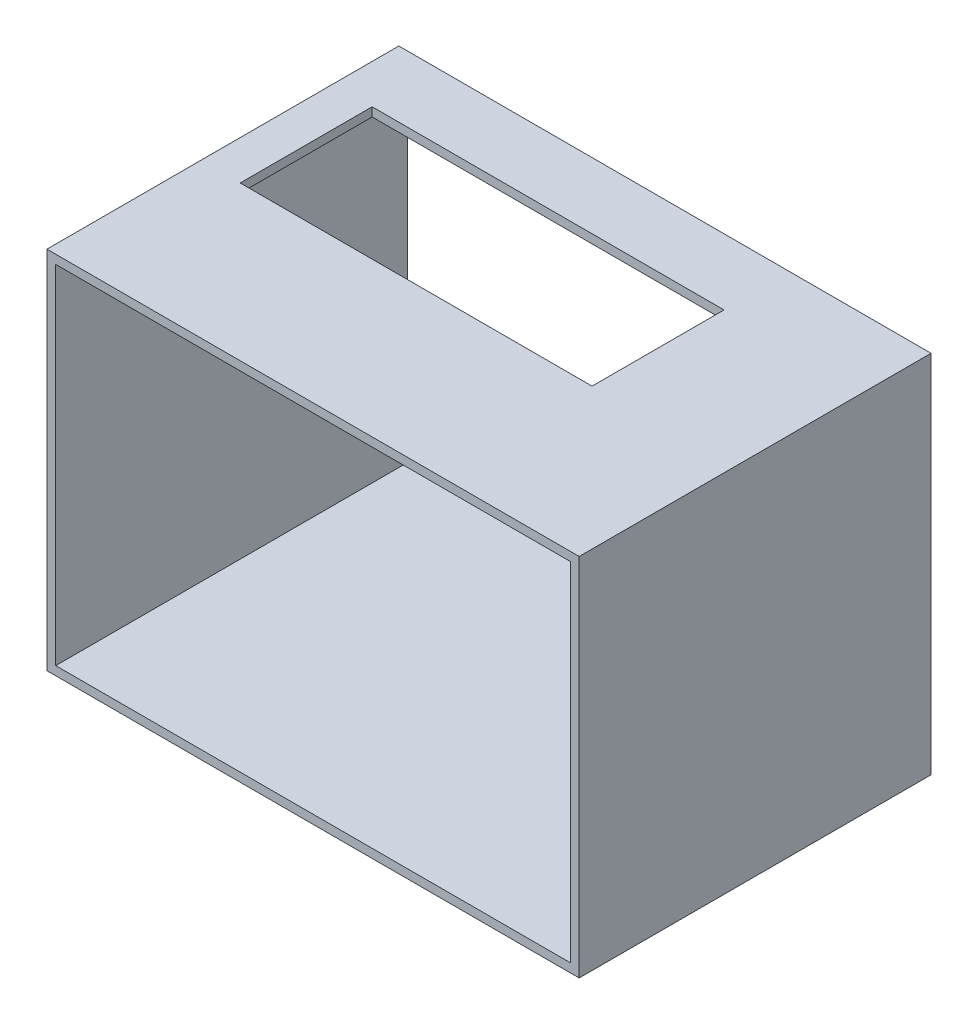
ISO-10303-21;
HEADER;
FILE_DESCRIPTION(('STEP AP214'),'2;1');
FILE_NAME('part.step','',(''),(''),'','','');
FILE_SCHEMA(('AUTOMOTIVE_DESIGN { 1 0 10303 214 1 1 1 1 }'));
ENDSEC;
DATA;
#1=APPLICATION_CONTEXT('core data for automotive mechanical design processes');
#2=APPLICATION_PROTOCOL_DEFINITION('international standard','automotive_design',2000,#1);
#3=PRODUCT_CONTEXT('',#1,'mechanical');
#4=PRODUCT('Part','Part','',(#3));
#5=PRODUCT_RELATED_PRODUCT_CATEGORY('part','',(#4));
#6=PRODUCT_DEFINITION_FORMATION('','',#4);
#7=PRODUCT_DEFINITION_CONTEXT('part definition',#1,'design');
#8=PRODUCT_DEFINITION('design','',#6,#7);
#9=PRODUCT_DEFINITION_SHAPE('','',#8);
#10=(LENGTH_UNIT() NAMED_UNIT(*) SI_UNIT(.MILLI.,.METRE.));
#11=(NAMED_UNIT(*) PLANE_ANGLE_UNIT() SI_UNIT($,.RADIAN.));
#12=(NAMED_UNIT(*) SI_UNIT($,.STERADIAN.) SOLID_ANGLE_UNIT());
#13=UNCERTAINTY_MEASURE_WITH_UNIT(LENGTH_MEASURE(1.E-05),#10,'distance_accuracy_value','');
#14=(GEOMETRIC_REPRESENTATION_CONTEXT(3) GLOBAL_UNCERTAINTY_ASSIGNED_CONTEXT((#13)) GLOBAL_UNIT_ASSIGNED_CONTEXT((#10,
#11,#12)) REPRESENTATION_CONTEXT('',''));
#15=CARTESIAN_POINT('',(0.,0.,0.));
#16=DIRECTION('',(0.,0.,1.));
#17=DIRECTION('',(1.,0.,0.));
#18=AXIS2_PLACEMENT_3D('',#15,#16,#17);
#19=CARTESIAN_POINT('',(0.,0.,80.));
#20=DIRECTION('',(0.,0.,1.));
#21=DIRECTION('',(1.,0.,0.));
#22=AXIS2_PLACEMENT_3D('',#19,#20,#21);
#23=PLANE('',#22);
#24=DIRECTION('',(0.,-1.,0.));
#25=VECTOR('',#24,1.);
#26=CARTESIAN_POINT('',(-40.1361731843575,31.6864525139665,80.));
#27=LINE('',#26,#25);
#28=CARTESIAN_POINT('',(-40.1361731843575,31.6864525139665,80.));
#29=VERTEX_POINT('',#28);
#30=CARTESIAN_POINT('',(-40.1361731843575,-51.3135474860335,80.));
#31=VERTEX_POINT('',#30);
#32=EDGE_CURVE('E211',#29,#31,#27,.T.);
#33=ORIENTED_EDGE('',*,*,#32,.T.);
#34=DIRECTION('',(1.,0.,0.));
#35=VECTOR('',#34,1.);
#36=CARTESIAN_POINT('',(-40.1361731843575,-51.3135474860335,80.));
#37=LINE('',#36,#35);
#38=CARTESIAN_POINT('',(80.8638268156425,-51.3135474860335,80.));
#39=VERTEX_POINT('',#38);
#40=EDGE_CURVE('E215',#31,#39,#37,.T.);
#41=ORIENTED_EDGE('',*,*,#40,.T.);
#42=DIRECTION('',(0.,1.,0.));
#43=VECTOR('',#42,1.);
#44=CARTESIAN_POINT('',(80.8638268156425,31.6864525139665,80.));
#45=LINE('',#44,#43);
#46=CARTESIAN_POINT('',(80.8638268156425,31.6864525139665,80.));
#47=VERTEX_POINT('',#46);
#48=EDGE_CURVE('E219',#39,#47,#45,.T.);
#49=ORIENTED_EDGE('',*,*,#48,.T.);
#50=DIRECTION('',(-1.,0.,0.));
#51=VECTOR('',#50,1.);
#52=CARTESIAN_POINT('',(-40.1361731843575,31.6864525139665,80.));
#53=LINE('',#52,#51);
#54=EDGE_CURVE('E222',#47,#29,#53,.T.);
#55=ORIENTED_EDGE('',*,*,#54,.T.);
#56=EDGE_LOOP('',(#33,#41,#49,#55));
#57=FACE_BOUND('',#56,.T.);
#58=DIRECTION('',(1.,0.,0.));
#59=VECTOR('',#58,1.);
#60=CARTESIAN_POINT('',(-38.1361731843575,-49.3135474860335,80.));
#61=LINE('',#60,#59);
#62=CARTESIAN_POINT('',(-38.1361731843575,-49.3135474860335,80.));
#63=VERTEX_POINT('',#62);
#64=CARTESIAN_POINT('',(78.8638268156425,-49.3135474860335,80.));
#65=VERTEX_POINT('',#64);
#66=EDGE_CURVE('E171',#63,#65,#61,.T.);
#67=ORIENTED_EDGE('',*,*,#66,.F.);
#68=DIRECTION('',(0.,-1.,0.));
#69=VECTOR('',#68,1.);
#70=CARTESIAN_POINT('',(-38.1361731843575,29.6864525139665,80.));
#71=LINE('',#70,#69);
#72=CARTESIAN_POINT('',(-38.1361731843575,29.6864525139665,80.));
#73=VERTEX_POINT('',#72);
#74=EDGE_CURVE('E168',#73,#63,#71,.T.);
#75=ORIENTED_EDGE('',*,*,#74,.F.);
#76=DIRECTION('',(-1.,0.,0.));
#77=VECTOR('',#76,1.);
#78=CARTESIAN_POINT('',(-38.1361731843575,29.6864525139665,80.));
#79=LINE('',#78,#77);
#80=CARTESIAN_POINT('',(78.8638268156425,29.6864525139665,80.));
#81=VERTEX_POINT('',#80);
#82=EDGE_CURVE('E179',#81,#73,#79,.T.);
#83=ORIENTED_EDGE('',*,*,#82,.F.);
#84=DIRECTION('',(0.,1.,0.));
#85=VECTOR('',#84,1.);
#86=CARTESIAN_POINT('',(78.8638268156425,29.6864525139665,80.));
#87=LINE('',#86,#85);
#88=EDGE_CURVE('E175',#65,#81,#87,.T.);
#89=ORIENTED_EDGE('',*,*,#88,.F.);
#90=EDGE_LOOP('',(#67,#75,#83,#89));
#91=FACE_BOUND('',#90,.T.);
#92=ADVANCED_FACE('F43',(#57,#91),#23,.T.);
#93=CARTESIAN_POINT('',(0.,0.,0.));
#94=DIRECTION('',(0.,0.,1.));
#95=DIRECTION('',(1.,0.,0.));
#96=AXIS2_PLACEMENT_3D('',#93,#94,#95);
#97=PLANE('',#96);
#98=DIRECTION('',(0.,-1.,0.));
#99=VECTOR('',#98,1.);
#100=CARTESIAN_POINT('',(-40.1361731843575,31.6864525139665,0.));
#101=LINE('',#100,#99);
#102=CARTESIAN_POINT('',(-40.1361731843575,31.6864525139665,0.));
#103=VERTEX_POINT('',#102);
#104=CARTESIAN_POINT('',(-40.1361731843575,-51.3135474860335,0.));
#105=VERTEX_POINT('',#104);
#106=EDGE_CURVE('E210',#103,#105,#101,.T.);
#107=ORIENTED_EDGE('',*,*,#106,.F.);
#108=DIRECTION('',(-1.,0.,0.));
#109=VECTOR('',#108,1.);
#110=CARTESIAN_POINT('',(-40.1361731843575,31.6864525139665,0.));
#111=LINE('',#110,#109);
#112=CARTESIAN_POINT('',(80.8638268156425,31.6864525139665,0.));
#113=VERTEX_POINT('',#112);
#114=EDGE_CURVE('E216',#113,#103,#111,.T.);
#115=ORIENTED_EDGE('',*,*,#114,.F.);
#116=DIRECTION('',(0.,1.,0.));
#117=VECTOR('',#116,1.);
#118=CARTESIAN_POINT('',(80.8638268156425,31.6864525139665,0.));
#119=LINE('',#118,#117);
#120=CARTESIAN_POINT('',(80.8638268156425,-51.3135474860335,0.));
#121=VERTEX_POINT('',#120);
#122=EDGE_CURVE('E232',#121,#113,#119,.T.);
#123=ORIENTED_EDGE('',*,*,#122,.F.);
#124=DIRECTION('',(1.,0.,0.));
#125=VECTOR('',#124,1.);
#126=CARTESIAN_POINT('',(-40.1361731843575,-51.3135474860335,0.));
#127=LINE('',#126,#125);
#128=EDGE_CURVE('E229',#105,#121,#127,.T.);
#129=ORIENTED_EDGE('',*,*,#128,.F.);
#130=EDGE_LOOP('',(#107,#115,#123,#129));
#131=FACE_BOUND('',#130,.T.);
#132=DIRECTION('',(0.,-1.,0.));
#133=VECTOR('',#132,1.);
#134=CARTESIAN_POINT('',(-38.1361731843575,29.6864525139665,0.));
#135=LINE('',#134,#133);
#136=CARTESIAN_POINT('',(-38.1361731843575,29.6864525139665,0.));
#137=VERTEX_POINT('',#136);
#138=CARTESIAN_POINT('',(-38.1361731843575,-49.3135474860335,0.));
#139=VERTEX_POINT('',#138);
#140=EDGE_CURVE('E163',#137,#139,#135,.T.);
#141=ORIENTED_EDGE('',*,*,#140,.T.);
#142=DIRECTION('',(1.,0.,0.));
#143=VECTOR('',#142,1.);
#144=CARTESIAN_POINT('',(-38.1361731843575,-49.3135474860335,0.));
#145=LINE('',#144,#143);
#146=CARTESIAN_POINT('',(78.8638268156425,-49.3135474860335,0.));
#147=VERTEX_POINT('',#146);
#148=EDGE_CURVE('E186',#139,#147,#145,.T.);
#149=ORIENTED_EDGE('',*,*,#148,.T.);
#150=DIRECTION('',(0.,1.,0.));
#151=VECTOR('',#150,1.);
#152=CARTESIAN_POINT('',(78.8638268156425,29.6864525139665,0.));
#153=LINE('',#152,#151);
#154=CARTESIAN_POINT('',(78.8638268156425,29.6864525139665,0.));
#155=VERTEX_POINT('',#154);
#156=EDGE_CURVE('E190',#147,#155,#153,.T.);
#157=ORIENTED_EDGE('',*,*,#156,.T.);
#158=DIRECTION('',(-1.,0.,0.));
#159=VECTOR('',#158,1.);
#160=CARTESIAN_POINT('',(-38.1361731843575,29.6864525139665,0.));
#161=LINE('',#160,#159);
#162=EDGE_CURVE('E172',#155,#137,#161,.T.);
#163=ORIENTED_EDGE('',*,*,#162,.T.);
#164=EDGE_LOOP('',(#141,#149,#157,#163));
#165=FACE_BOUND('',#164,.T.);
#166=ADVANCED_FACE('F278',(#131,#165),#97,.F.);
#167=CARTESIAN_POINT('',(-40.1361731843575,31.6864525139665,80.));
#168=DIRECTION('',(1.,0.,0.));
#169=DIRECTION('',(0.,1.,0.));
#170=AXIS2_PLACEMENT_3D('',#167,#168,#169);
#171=PLANE('',#170);
#172=ORIENTED_EDGE('',*,*,#106,.T.);
#173=DIRECTION('',(0.,0.,-1.));
#174=VECTOR('',#173,1.);
#175=CARTESIAN_POINT('',(-40.1361731843575,-51.3135474860335,80.));
#176=LINE('',#175,#174);
#177=EDGE_CURVE('E248',#31,#105,#176,.T.);
#178=ORIENTED_EDGE('',*,*,#177,.F.);
#179=ORIENTED_EDGE('',*,*,#32,.F.);
#180=DIRECTION('',(0.,0.,-1.));
#181=VECTOR('',#180,1.);
#182=CARTESIAN_POINT('',(-40.1361731843575,31.6864525139665,80.));
#183=LINE('',#182,#181);
#184=EDGE_CURVE('E225',#29,#103,#183,.T.);
#185=ORIENTED_EDGE('',*,*,#184,.T.);
#186=EDGE_LOOP('',(#172,#178,#179,#185));
#187=FACE_BOUND('',#186,.T.);
#188=ADVANCED_FACE('F45',(#187),#171,.F.);
#189=CARTESIAN_POINT('',(-40.1361731843575,-51.3135474860335,80.));
#190=DIRECTION('',(0.,1.,0.));
#191=DIRECTION('',(0.,0.,1.));
#192=AXIS2_PLACEMENT_3D('',#189,#190,#191);
#193=PLANE('',#192);
#194=ORIENTED_EDGE('',*,*,#128,.T.);
#195=DIRECTION('',(0.,0.,-1.));
#196=VECTOR('',#195,1.);
#197=CARTESIAN_POINT('',(80.8638268156425,-51.3135474860335,80.));
#198=LINE('',#197,#196);
#199=EDGE_CURVE('E244',#39,#121,#198,.T.);
#200=ORIENTED_EDGE('',*,*,#199,.F.);
#201=ORIENTED_EDGE('',*,*,#40,.F.);
#202=ORIENTED_EDGE('',*,*,#177,.T.);
#203=EDGE_LOOP('',(#194,#200,#201,#202));
#204=FACE_BOUND('',#203,.T.);
#205=ADVANCED_FACE('F295',(#204),#193,.F.);
#206=CARTESIAN_POINT('',(80.8638268156425,31.6864525139665,80.));
#207=DIRECTION('',(-1.,0.,0.));
#208=DIRECTION('',(0.,-1.,0.));
#209=AXIS2_PLACEMENT_3D('',#206,#207,#208);
#210=PLANE('',#209);
#211=ORIENTED_EDGE('',*,*,#122,.T.);
#212=DIRECTION('',(0.,0.,-1.));
#213=VECTOR('',#212,1.);
#214=CARTESIAN_POINT('',(80.8638268156425,31.6864525139665,80.));
#215=LINE('',#214,#213);
#216=EDGE_CURVE('E240',#47,#113,#215,.T.);
#217=ORIENTED_EDGE('',*,*,#216,.F.);
#218=ORIENTED_EDGE('',*,*,#48,.F.);
#219=ORIENTED_EDGE('',*,*,#199,.T.);
#220=EDGE_LOOP('',(#211,#217,#218,#219));
#221=FACE_BOUND('',#220,.T.);
#222=ADVANCED_FACE('F293',(#221),#210,.F.);
#223=CARTESIAN_POINT('',(-40.1361731843575,31.6864525139665,80.));
#224=DIRECTION('',(0.,-1.,0.));
#225=DIRECTION('',(0.,0.,-1.));
#226=AXIS2_PLACEMENT_3D('',#223,#224,#225);
#227=PLANE('',#226);
#228=DIRECTION('',(0.,0.,1.));
#229=VECTOR('',#228,1.);
#230=CARTESIAN_POINT('',(48.7981780211698,31.6864525139665,15.));
#231=LINE('',#230,#229);
#232=CARTESIAN_POINT('',(48.7981780211698,31.6864525139665,15.));
#233=VERTEX_POINT('',#232);
#234=CARTESIAN_POINT('',(48.7981780211698,31.6864525139665,45.));
#235=VERTEX_POINT('',#234);
#236=EDGE_CURVE('E145',#233,#235,#231,.T.);
#237=ORIENTED_EDGE('',*,*,#236,.T.);
#238=DIRECTION('',(1.,0.,0.));
#239=VECTOR('',#238,1.);
#240=CARTESIAN_POINT('',(-31.2018219788302,31.6864525139665,45.));
#241=LINE('',#240,#239);
#242=CARTESIAN_POINT('',(-31.2018219788302,31.6864525139665,45.));
#243=VERTEX_POINT('',#242);
#244=EDGE_CURVE('E59',#243,#235,#241,.T.);
#245=ORIENTED_EDGE('',*,*,#244,.F.);
#246=DIRECTION('',(0.,0.,1.));
#247=VECTOR('',#246,1.);
#248=CARTESIAN_POINT('',(-31.2018219788302,31.6864525139665,15.));
#249=LINE('',#248,#247);
#250=CARTESIAN_POINT('',(-31.2018219788302,31.6864525139665,15.));
#251=VERTEX_POINT('',#250);
#252=EDGE_CURVE('E153',#251,#243,#249,.T.);
#253=ORIENTED_EDGE('',*,*,#252,.F.);
#254=DIRECTION('',(1.,0.,0.));
#255=VECTOR('',#254,1.);
#256=CARTESIAN_POINT('',(-31.2018219788302,31.6864525139665,15.));
#257=LINE('',#256,#255);
#258=EDGE_CURVE('E135',#251,#233,#257,.T.);
#259=ORIENTED_EDGE('',*,*,#258,.T.);
#260=EDGE_LOOP('',(#237,#245,#253,#259));
#261=FACE_BOUND('',#260,.T.);
#262=ORIENTED_EDGE('',*,*,#114,.T.);
#263=ORIENTED_EDGE('',*,*,#184,.F.);
#264=ORIENTED_EDGE('',*,*,#54,.F.);
#265=ORIENTED_EDGE('',*,*,#216,.T.);
#266=EDGE_LOOP('',(#262,#263,#264,#265));
#267=FACE_BOUND('',#266,.T.);
#268=ADVANCED_FACE('F150',(#261,#267),#227,.F.);
#269=CARTESIAN_POINT('',(-38.1361731843575,29.6864525139665,80.));
#270=DIRECTION('',(1.,0.,0.));
#271=DIRECTION('',(0.,1.,0.));
#272=AXIS2_PLACEMENT_3D('',#269,#270,#271);
#273=PLANE('',#272);
#274=ORIENTED_EDGE('',*,*,#140,.F.);
#275=DIRECTION('',(0.,0.,-1.));
#276=VECTOR('',#275,1.);
#277=CARTESIAN_POINT('',(-38.1361731843575,29.6864525139665,80.));
#278=LINE('',#277,#276);
#279=EDGE_CURVE('E182',#73,#137,#278,.T.);
#280=ORIENTED_EDGE('',*,*,#279,.F.);
#281=ORIENTED_EDGE('',*,*,#74,.T.);
#282=DIRECTION('',(0.,0.,-1.));
#283=VECTOR('',#282,1.);
#284=CARTESIAN_POINT('',(-38.1361731843575,-49.3135474860335,80.));
#285=LINE('',#284,#283);
#286=EDGE_CURVE('E206',#63,#139,#285,.T.);
#287=ORIENTED_EDGE('',*,*,#286,.T.);
#288=EDGE_LOOP('',(#274,#280,#281,#287));
#289=FACE_BOUND('',#288,.T.);
#290=ADVANCED_FACE('F288',(#289),#273,.T.);
#291=CARTESIAN_POINT('',(-38.1361731843575,-49.3135474860335,80.));
#292=DIRECTION('',(0.,1.,0.));
#293=DIRECTION('',(0.,0.,1.));
#294=AXIS2_PLACEMENT_3D('',#291,#292,#293);
#295=PLANE('',#294);
#296=ORIENTED_EDGE('',*,*,#148,.F.);
#297=ORIENTED_EDGE('',*,*,#286,.F.);
#298=ORIENTED_EDGE('',*,*,#66,.T.);
#299=DIRECTION('',(0.,0.,-1.));
#300=VECTOR('',#299,1.);
#301=CARTESIAN_POINT('',(78.8638268156425,-49.3135474860335,80.));
#302=LINE('',#301,#300);
#303=EDGE_CURVE('E203',#65,#147,#302,.T.);
#304=ORIENTED_EDGE('',*,*,#303,.T.);
#305=EDGE_LOOP('',(#296,#297,#298,#304));
#306=FACE_BOUND('',#305,.T.);
#307=ADVANCED_FACE('F323',(#306),#295,.T.);
#308=CARTESIAN_POINT('',(78.8638268156425,29.6864525139665,80.));
#309=DIRECTION('',(-1.,0.,0.));
#310=DIRECTION('',(0.,-1.,0.));
#311=AXIS2_PLACEMENT_3D('',#308,#309,#310);
#312=PLANE('',#311);
#313=ORIENTED_EDGE('',*,*,#156,.F.);
#314=ORIENTED_EDGE('',*,*,#303,.F.);
#315=ORIENTED_EDGE('',*,*,#88,.T.);
#316=DIRECTION('',(0.,0.,-1.));
#317=VECTOR('',#316,1.);
#318=CARTESIAN_POINT('',(78.8638268156425,29.6864525139665,80.));
#319=LINE('',#318,#317);
#320=EDGE_CURVE('E200',#81,#155,#319,.T.);
#321=ORIENTED_EDGE('',*,*,#320,.T.);
#322=EDGE_LOOP('',(#313,#314,#315,#321));
#323=FACE_BOUND('',#322,.T.);
#324=ADVANCED_FACE('F274',(#323),#312,.T.);
#325=CARTESIAN_POINT('',(-38.1361731843575,29.6864525139665,80.));
#326=DIRECTION('',(0.,-1.,0.));
#327=DIRECTION('',(0.,0.,-1.));
#328=AXIS2_PLACEMENT_3D('',#325,#326,#327);
#329=PLANE('',#328);
#330=DIRECTION('',(-1.,0.,0.));
#331=VECTOR('',#330,1.);
#332=CARTESIAN_POINT('',(-38.1361731843575,29.6864525139665,45.));
#333=LINE('',#332,#331);
#334=CARTESIAN_POINT('',(48.7981780211698,29.6864525139665,45.));
#335=VERTEX_POINT('',#334);
#336=CARTESIAN_POINT('',(-31.2018219788302,29.6864525139665,45.));
#337=VERTEX_POINT('',#336);
#338=EDGE_CURVE('E11',#335,#337,#333,.T.);
#339=ORIENTED_EDGE('',*,*,#338,.F.);
#340=DIRECTION('',(0.,0.,-1.));
#341=VECTOR('',#340,1.);
#342=CARTESIAN_POINT('',(48.7981780211698,29.6864525139665,80.));
#343=LINE('',#342,#341);
#344=CARTESIAN_POINT('',(48.7981780211698,29.6864525139665,15.));
#345=VERTEX_POINT('',#344);
#346=EDGE_CURVE('E252',#335,#345,#343,.T.);
#347=ORIENTED_EDGE('',*,*,#346,.T.);
#348=DIRECTION('',(-1.,0.,0.));
#349=VECTOR('',#348,1.);
#350=CARTESIAN_POINT('',(-38.1361731843575,29.6864525139665,15.));
#351=LINE('',#350,#349);
#352=CARTESIAN_POINT('',(-31.2018219788302,29.6864525139665,15.));
#353=VERTEX_POINT('',#352);
#354=EDGE_CURVE('E138',#345,#353,#351,.T.);
#355=ORIENTED_EDGE('',*,*,#354,.T.);
#356=DIRECTION('',(0.,0.,-1.));
#357=VECTOR('',#356,1.);
#358=CARTESIAN_POINT('',(-31.2018219788302,29.6864525139665,80.));
#359=LINE('',#358,#357);
#360=EDGE_CURVE('E52',#337,#353,#359,.T.);
#361=ORIENTED_EDGE('',*,*,#360,.F.);
#362=EDGE_LOOP('',(#339,#347,#355,#361));
#363=FACE_BOUND('',#362,.T.);
#364=ORIENTED_EDGE('',*,*,#162,.F.);
#365=ORIENTED_EDGE('',*,*,#320,.F.);
#366=ORIENTED_EDGE('',*,*,#82,.T.);
#367=ORIENTED_EDGE('',*,*,#279,.T.);
#368=EDGE_LOOP('',(#364,#365,#366,#367));
#369=FACE_BOUND('',#368,.T.);
#370=ADVANCED_FACE('F263',(#363,#369),#329,.T.);
#371=CARTESIAN_POINT('',(-31.2018219788302,27.6864525139665,45.));
#372=DIRECTION('',(0.,0.,1.));
#373=DIRECTION('',(1.,0.,0.));
#374=AXIS2_PLACEMENT_3D('',#371,#372,#373);
#375=PLANE('',#374);
#376=ORIENTED_EDGE('',*,*,#338,.T.);
#377=DIRECTION('',(0.,1.,0.));
#378=VECTOR('',#377,1.);
#379=CARTESIAN_POINT('',(-31.2018219788302,27.6864525139665,45.));
#380=LINE('',#379,#378);
#381=EDGE_CURVE('E160',#337,#243,#380,.T.);
#382=ORIENTED_EDGE('',*,*,#381,.T.);
#383=ORIENTED_EDGE('',*,*,#244,.T.);
#384=DIRECTION('',(0.,1.,0.));
#385=VECTOR('',#384,1.);
#386=CARTESIAN_POINT('',(48.7981780211698,27.6864525139665,45.));
#387=LINE('',#386,#385);
#388=EDGE_CURVE('E142',#335,#235,#387,.T.);
#389=ORIENTED_EDGE('',*,*,#388,.F.);
#390=EDGE_LOOP('',(#376,#382,#383,#389));
#391=FACE_BOUND('',#390,.T.);
#392=ADVANCED_FACE('F265',(#391),#375,.F.);
#393=CARTESIAN_POINT('',(-31.2018219788302,27.6864525139665,15.));
#394=DIRECTION('',(-1.,0.,0.));
#395=DIRECTION('',(0.,0.,1.));
#396=AXIS2_PLACEMENT_3D('',#393,#394,#395);
#397=PLANE('',#396);
#398=ORIENTED_EDGE('',*,*,#360,.T.);
#399=DIRECTION('',(0.,1.,0.));
#400=VECTOR('',#399,1.);
#401=CARTESIAN_POINT('',(-31.2018219788302,27.6864525139665,15.));
#402=LINE('',#401,#400);
#403=EDGE_CURVE('E141',#353,#251,#402,.T.);
#404=ORIENTED_EDGE('',*,*,#403,.T.);
#405=ORIENTED_EDGE('',*,*,#252,.T.);
#406=ORIENTED_EDGE('',*,*,#381,.F.);
#407=EDGE_LOOP('',(#398,#404,#405,#406));
#408=FACE_BOUND('',#407,.T.);
#409=ADVANCED_FACE('F260',(#408),#397,.F.);
#410=CARTESIAN_POINT('',(-31.2018219788302,27.6864525139665,15.));
#411=DIRECTION('',(0.,0.,1.));
#412=DIRECTION('',(1.,0.,0.));
#413=AXIS2_PLACEMENT_3D('',#410,#411,#412);
#414=PLANE('',#413);
#415=DIRECTION('',(0.,1.,0.));
#416=VECTOR('',#415,1.);
#417=CARTESIAN_POINT('',(48.7981780211698,27.6864525139665,15.));
#418=LINE('',#417,#416);
#419=EDGE_CURVE('E67',#345,#233,#418,.T.);
#420=ORIENTED_EDGE('',*,*,#419,.T.);
#421=ORIENTED_EDGE('',*,*,#258,.F.);
#422=ORIENTED_EDGE('',*,*,#403,.F.);
#423=ORIENTED_EDGE('',*,*,#354,.F.);
#424=EDGE_LOOP('',(#420,#421,#422,#423));
#425=FACE_BOUND('',#424,.T.);
#426=ADVANCED_FACE('F132',(#425),#414,.T.);
#427=CARTESIAN_POINT('',(48.7981780211698,27.6864525139665,15.));
#428=DIRECTION('',(-1.,0.,0.));
#429=DIRECTION('',(0.,0.,1.));
#430=AXIS2_PLACEMENT_3D('',#427,#428,#429);
#431=PLANE('',#430);
#432=ORIENTED_EDGE('',*,*,#388,.T.);
#433=ORIENTED_EDGE('',*,*,#236,.F.);
#434=ORIENTED_EDGE('',*,*,#419,.F.);
#435=ORIENTED_EDGE('',*,*,#346,.F.);
#436=EDGE_LOOP('',(#432,#433,#434,#435));
#437=FACE_BOUND('',#436,.T.);
#438=ADVANCED_FACE('F146',(#437),#431,.T.);
#439=CLOSED_SHELL('',(#92,#166,#188,#205,#222,#268,#290,#307,#324,#370,#392,#409,#426,#438));
#440=MANIFOLD_SOLID_BREP('B2',#439);
#441=ADVANCED_BREP_SHAPE_REPRESENTATION('',(#18,#440),#14);
#442=SHAPE_DEFINITION_REPRESENTATION(#9,#441);
ENDSEC;
END-ISO-10303-21;
